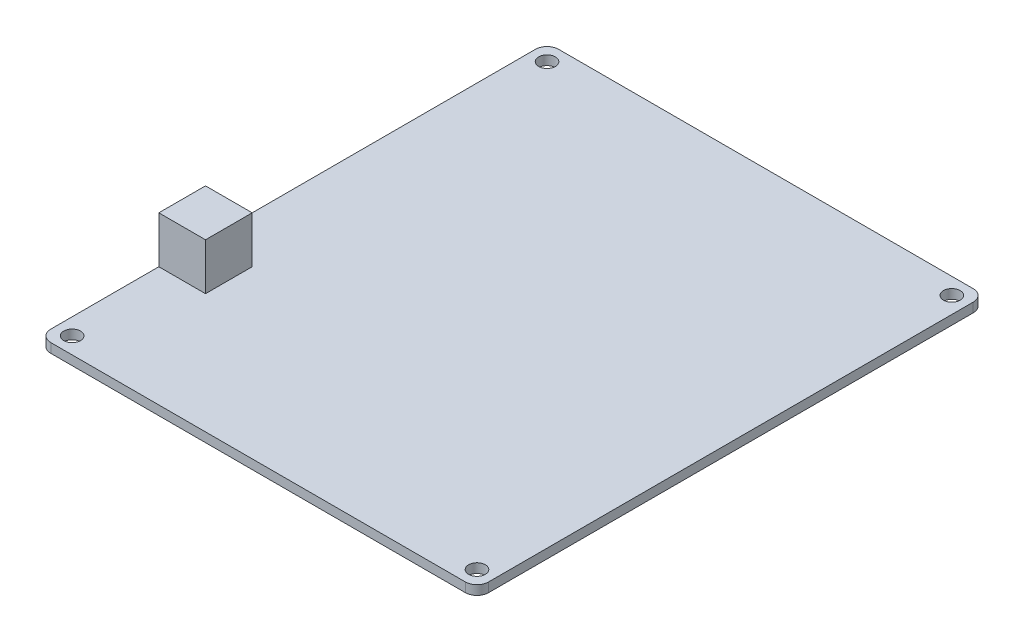
ISO-10303-21;
HEADER;
FILE_DESCRIPTION(('STEP AP214'),'2;1');
FILE_NAME('part.step','',(''),(''),'','','');
FILE_SCHEMA(('AUTOMOTIVE_DESIGN { 1 0 10303 214 1 1 1 1 }'));
ENDSEC;
DATA;
#1=APPLICATION_CONTEXT('core data for automotive mechanical design processes');
#2=APPLICATION_PROTOCOL_DEFINITION('international standard','automotive_design',2000,#1);
#3=PRODUCT_CONTEXT('',#1,'mechanical');
#4=PRODUCT('Part','Part','',(#3));
#5=PRODUCT_RELATED_PRODUCT_CATEGORY('part','',(#4));
#6=PRODUCT_DEFINITION_FORMATION('','',#4);
#7=PRODUCT_DEFINITION_CONTEXT('part definition',#1,'design');
#8=PRODUCT_DEFINITION('design','',#6,#7);
#9=PRODUCT_DEFINITION_SHAPE('','',#8);
#10=(LENGTH_UNIT() NAMED_UNIT(*) SI_UNIT(.MILLI.,.METRE.));
#11=(NAMED_UNIT(*) PLANE_ANGLE_UNIT() SI_UNIT($,.RADIAN.));
#12=(NAMED_UNIT(*) SI_UNIT($,.STERADIAN.) SOLID_ANGLE_UNIT());
#13=UNCERTAINTY_MEASURE_WITH_UNIT(LENGTH_MEASURE(1.E-05),#10,'distance_accuracy_value','');
#14=(GEOMETRIC_REPRESENTATION_CONTEXT(3) GLOBAL_UNCERTAINTY_ASSIGNED_CONTEXT((#13)) GLOBAL_UNIT_ASSIGNED_CONTEXT((#10,
#11,#12)) REPRESENTATION_CONTEXT('',''));
#15=CARTESIAN_POINT('',(0.,0.,0.));
#16=DIRECTION('',(0.,0.,1.));
#17=DIRECTION('',(1.,0.,0.));
#18=AXIS2_PLACEMENT_3D('',#15,#16,#17);
#19=CARTESIAN_POINT('',(-37.5,1.6,43.5));
#20=DIRECTION('',(0.,0.,-1.));
#21=DIRECTION('',(-1.,0.,0.));
#22=AXIS2_PLACEMENT_3D('',#19,#20,#21);
#23=PLANE('',#22);
#24=DIRECTION('',(1.,0.,0.));
#25=VECTOR('',#24,1.);
#26=CARTESIAN_POINT('',(-37.5,0.,43.5));
#27=LINE('',#26,#25);
#28=CARTESIAN_POINT('',(-35.5,0.,43.5));
#29=VERTEX_POINT('',#28);
#30=CARTESIAN_POINT('',(35.5,0.,43.5));
#31=VERTEX_POINT('',#30);
#32=EDGE_CURVE('E197',#29,#31,#27,.T.);
#33=ORIENTED_EDGE('',*,*,#32,.T.);
#34=DIRECTION('',(0.,-1.,0.));
#35=VECTOR('',#34,1.);
#36=CARTESIAN_POINT('',(35.5,1.6,43.5));
#37=LINE('',#36,#35);
#38=CARTESIAN_POINT('',(35.5,1.6,43.5));
#39=VERTEX_POINT('',#38);
#40=EDGE_CURVE('E253',#31,#39,#37,.F.);
#41=ORIENTED_EDGE('',*,*,#40,.T.);
#42=DIRECTION('',(1.,0.,0.));
#43=VECTOR('',#42,1.);
#44=CARTESIAN_POINT('',(-37.5,1.6,43.5));
#45=LINE('',#44,#43);
#46=CARTESIAN_POINT('',(-35.5,1.6,43.5));
#47=VERTEX_POINT('',#46);
#48=EDGE_CURVE('E201',#47,#39,#45,.T.);
#49=ORIENTED_EDGE('',*,*,#48,.F.);
#50=DIRECTION('',(0.,-1.,0.));
#51=VECTOR('',#50,1.);
#52=CARTESIAN_POINT('',(-35.5,0.,43.5));
#53=LINE('',#52,#51);
#54=EDGE_CURVE('E249',#47,#29,#53,.T.);
#55=ORIENTED_EDGE('',*,*,#54,.T.);
#56=EDGE_LOOP('',(#33,#41,#49,#55));
#57=FACE_BOUND('',#56,.T.);
#58=ADVANCED_FACE('F45',(#57),#23,.F.);
#59=CARTESIAN_POINT('',(37.5,1.6,43.5));
#60=DIRECTION('',(-1.,0.,0.));
#61=DIRECTION('',(0.,0.,1.));
#62=AXIS2_PLACEMENT_3D('',#59,#60,#61);
#63=PLANE('',#62);
#64=DIRECTION('',(0.,0.,-1.));
#65=VECTOR('',#64,1.);
#66=CARTESIAN_POINT('',(37.5,1.6,43.5));
#67=LINE('',#66,#65);
#68=CARTESIAN_POINT('',(37.5,1.6,41.5));
#69=VERTEX_POINT('',#68);
#70=CARTESIAN_POINT('',(37.5,1.6,-41.5));
#71=VERTEX_POINT('',#70);
#72=EDGE_CURVE('E205',#69,#71,#67,.T.);
#73=ORIENTED_EDGE('',*,*,#72,.F.);
#74=DIRECTION('',(0.,-1.,0.));
#75=VECTOR('',#74,1.);
#76=CARTESIAN_POINT('',(37.5,1.6,41.5));
#77=LINE('',#76,#75);
#78=CARTESIAN_POINT('',(37.5,0.,41.5));
#79=VERTEX_POINT('',#78);
#80=EDGE_CURVE('E233',#69,#79,#77,.T.);
#81=ORIENTED_EDGE('',*,*,#80,.T.);
#82=DIRECTION('',(0.,0.,-1.));
#83=VECTOR('',#82,1.);
#84=CARTESIAN_POINT('',(37.5,0.,43.5));
#85=LINE('',#84,#83);
#86=CARTESIAN_POINT('',(37.5,0.,-41.5));
#87=VERTEX_POINT('',#86);
#88=EDGE_CURVE('E220',#79,#87,#85,.T.);
#89=ORIENTED_EDGE('',*,*,#88,.T.);
#90=DIRECTION('',(0.,-1.,0.));
#91=VECTOR('',#90,1.);
#92=CARTESIAN_POINT('',(37.5,1.6,-41.5));
#93=LINE('',#92,#91);
#94=EDGE_CURVE('E216',#87,#71,#93,.F.);
#95=ORIENTED_EDGE('',*,*,#94,.T.);
#96=EDGE_LOOP('',(#73,#81,#89,#95));
#97=FACE_BOUND('',#96,.T.);
#98=ADVANCED_FACE('F305',(#97),#63,.F.);
#99=CARTESIAN_POINT('',(-37.5,1.6,-43.5));
#100=DIRECTION('',(0.,0.,-1.));
#101=DIRECTION('',(-1.,0.,0.));
#102=AXIS2_PLACEMENT_3D('',#99,#100,#101);
#103=PLANE('',#102);
#104=DIRECTION('',(1.,0.,0.));
#105=VECTOR('',#104,1.);
#106=CARTESIAN_POINT('',(-37.5,1.6,-43.5));
#107=LINE('',#106,#105);
#108=CARTESIAN_POINT('',(-35.5,1.6,-43.5));
#109=VERTEX_POINT('',#108);
#110=CARTESIAN_POINT('',(35.5,1.6,-43.5));
#111=VERTEX_POINT('',#110);
#112=EDGE_CURVE('E210',#109,#111,#107,.T.);
#113=ORIENTED_EDGE('',*,*,#112,.T.);
#114=DIRECTION('',(0.,-1.,0.));
#115=VECTOR('',#114,1.);
#116=CARTESIAN_POINT('',(35.5,0.,-43.5));
#117=LINE('',#116,#115);
#118=CARTESIAN_POINT('',(35.5,0.,-43.5));
#119=VERTEX_POINT('',#118);
#120=EDGE_CURVE('E11',#111,#119,#117,.T.);
#121=ORIENTED_EDGE('',*,*,#120,.T.);
#122=DIRECTION('',(1.,0.,0.));
#123=VECTOR('',#122,1.);
#124=CARTESIAN_POINT('',(-37.5,0.,-43.5));
#125=LINE('',#124,#123);
#126=CARTESIAN_POINT('',(-35.5,0.,-43.5));
#127=VERTEX_POINT('',#126);
#128=EDGE_CURVE('E224',#127,#119,#125,.T.);
#129=ORIENTED_EDGE('',*,*,#128,.F.);
#130=DIRECTION('',(0.,-1.,0.));
#131=VECTOR('',#130,1.);
#132=CARTESIAN_POINT('',(-35.5,1.6,-43.5));
#133=LINE('',#132,#131);
#134=EDGE_CURVE('E54',#127,#109,#133,.F.);
#135=ORIENTED_EDGE('',*,*,#134,.T.);
#136=EDGE_LOOP('',(#113,#121,#129,#135));
#137=FACE_BOUND('',#136,.T.);
#138=ADVANCED_FACE('F279',(#137),#103,.T.);
#139=CARTESIAN_POINT('',(-37.5,1.6,43.5));
#140=DIRECTION('',(-1.,0.,0.));
#141=DIRECTION('',(0.,0.,1.));
#142=AXIS2_PLACEMENT_3D('',#139,#140,#141);
#143=PLANE('',#142);
#144=DIRECTION('',(0.,0.,-1.));
#145=VECTOR('',#144,1.);
#146=CARTESIAN_POINT('',(-37.5,0.,43.5));
#147=LINE('',#146,#145);
#148=CARTESIAN_POINT('',(-37.5,0.,41.5));
#149=VERTEX_POINT('',#148);
#150=CARTESIAN_POINT('',(-37.5,0.,-41.5));
#151=VERTEX_POINT('',#150);
#152=EDGE_CURVE('E206',#149,#151,#147,.T.);
#153=ORIENTED_EDGE('',*,*,#152,.F.);
#154=DIRECTION('',(0.,-1.,0.));
#155=VECTOR('',#154,1.);
#156=CARTESIAN_POINT('',(-37.5,1.6,41.5));
#157=LINE('',#156,#155);
#158=CARTESIAN_POINT('',(-37.5,1.6,41.5));
#159=VERTEX_POINT('',#158);
#160=EDGE_CURVE('E272',#149,#159,#157,.F.);
#161=ORIENTED_EDGE('',*,*,#160,.T.);
#162=DIRECTION('',(0.,0.,-1.));
#163=VECTOR('',#162,1.);
#164=CARTESIAN_POINT('',(-37.5,1.6,43.5));
#165=LINE('',#164,#163);
#166=CARTESIAN_POINT('',(-37.5,1.6,23.));
#167=VERTEX_POINT('',#166);
#168=EDGE_CURVE('E160',#159,#167,#165,.T.);
#169=ORIENTED_EDGE('',*,*,#168,.T.);
#170=DIRECTION('',(0.,-1.,0.));
#171=VECTOR('',#170,1.);
#172=CARTESIAN_POINT('',(-37.5,9.6,23.));
#173=LINE('',#172,#171);
#174=CARTESIAN_POINT('',(-37.5,9.6,23.));
#175=VERTEX_POINT('',#174);
#176=EDGE_CURVE('E138',#175,#167,#173,.T.);
#177=ORIENTED_EDGE('',*,*,#176,.F.);
#178=DIRECTION('',(0.,0.,1.));
#179=VECTOR('',#178,1.);
#180=CARTESIAN_POINT('',(-37.5,9.6,23.));
#181=LINE('',#180,#179);
#182=CARTESIAN_POINT('',(-37.5,9.6,15.));
#183=VERTEX_POINT('',#182);
#184=EDGE_CURVE('E145',#183,#175,#181,.T.);
#185=ORIENTED_EDGE('',*,*,#184,.F.);
#186=DIRECTION('',(0.,-1.,0.));
#187=VECTOR('',#186,1.);
#188=CARTESIAN_POINT('',(-37.5,9.6,15.));
#189=LINE('',#188,#187);
#190=CARTESIAN_POINT('',(-37.5,1.6,15.));
#191=VERTEX_POINT('',#190);
#192=EDGE_CURVE('E458',#183,#191,#189,.T.);
#193=ORIENTED_EDGE('',*,*,#192,.T.);
#194=CARTESIAN_POINT('',(-37.5,1.6,-41.5));
#195=VERTEX_POINT('',#194);
#196=EDGE_CURVE('E66',#191,#195,#165,.T.);
#197=ORIENTED_EDGE('',*,*,#196,.T.);
#198=DIRECTION('',(0.,-1.,0.));
#199=VECTOR('',#198,1.);
#200=CARTESIAN_POINT('',(-37.5,1.6,-41.5));
#201=LINE('',#200,#199);
#202=EDGE_CURVE('E268',#195,#151,#201,.T.);
#203=ORIENTED_EDGE('',*,*,#202,.T.);
#204=EDGE_LOOP('',(#153,#161,#169,#177,#185,#193,#197,#203));
#205=FACE_BOUND('',#204,.T.);
#206=ADVANCED_FACE('F158',(#205),#143,.T.);
#207=CARTESIAN_POINT('',(0.,1.6,0.));
#208=DIRECTION('',(0.,1.,0.));
#209=DIRECTION('',(0.,0.,1.));
#210=AXIS2_PLACEMENT_3D('',#207,#208,#209);
#211=PLANE('',#210);
#212=DIRECTION('',(-1.,0.,0.));
#213=VECTOR('',#212,1.);
#214=CARTESIAN_POINT('',(-29.5,1.6,15.));
#215=LINE('',#214,#213);
#216=CARTESIAN_POINT('',(-29.5,1.6,15.));
#217=VERTEX_POINT('',#216);
#218=EDGE_CURVE('E61',#217,#191,#215,.T.);
#219=ORIENTED_EDGE('',*,*,#218,.F.);
#220=DIRECTION('',(0.,0.,-1.));
#221=VECTOR('',#220,1.);
#222=CARTESIAN_POINT('',(-29.5,1.6,23.));
#223=LINE('',#222,#221);
#224=CARTESIAN_POINT('',(-29.5,1.6,23.));
#225=VERTEX_POINT('',#224);
#226=EDGE_CURVE('E461',#225,#217,#223,.T.);
#227=ORIENTED_EDGE('',*,*,#226,.F.);
#228=DIRECTION('',(1.,0.,0.));
#229=VECTOR('',#228,1.);
#230=CARTESIAN_POINT('',(-29.5,1.6,23.));
#231=LINE('',#230,#229);
#232=EDGE_CURVE('E471',#167,#225,#231,.T.);
#233=ORIENTED_EDGE('',*,*,#232,.F.);
#234=ORIENTED_EDGE('',*,*,#168,.F.);
#235=CARTESIAN_POINT('',(-35.5,1.6,41.5));
#236=DIRECTION('',(0.,1.,0.));
#237=DIRECTION('',(0.,0.,1.));
#238=AXIS2_PLACEMENT_3D('',#235,#236,#237);
#239=CIRCLE('',#238,2.);
#240=EDGE_CURVE('E262',#159,#47,#239,.T.);
#241=ORIENTED_EDGE('',*,*,#240,.T.);
#242=ORIENTED_EDGE('',*,*,#48,.T.);
#243=CARTESIAN_POINT('',(35.5,1.6,41.5));
#244=DIRECTION('',(0.,1.,0.));
#245=DIRECTION('',(0.,0.,1.));
#246=AXIS2_PLACEMENT_3D('',#243,#244,#245);
#247=CIRCLE('',#246,2.);
#248=EDGE_CURVE('E265',#39,#69,#247,.T.);
#249=ORIENTED_EDGE('',*,*,#248,.T.);
#250=ORIENTED_EDGE('',*,*,#72,.T.);
#251=CARTESIAN_POINT('',(35.5,1.6,-41.5));
#252=DIRECTION('',(0.,1.,0.));
#253=DIRECTION('',(0.,0.,1.));
#254=AXIS2_PLACEMENT_3D('',#251,#252,#253);
#255=CIRCLE('',#254,2.);
#256=EDGE_CURVE('E259',#71,#111,#255,.T.);
#257=ORIENTED_EDGE('',*,*,#256,.T.);
#258=ORIENTED_EDGE('',*,*,#112,.F.);
#259=CARTESIAN_POINT('',(-35.5,1.6,-41.5));
#260=DIRECTION('',(0.,1.,0.));
#261=DIRECTION('',(0.,0.,1.));
#262=AXIS2_PLACEMENT_3D('',#259,#260,#261);
#263=CIRCLE('',#262,2.);
#264=EDGE_CURVE('E256',#109,#195,#263,.T.);
#265=ORIENTED_EDGE('',*,*,#264,.T.);
#266=ORIENTED_EDGE('',*,*,#196,.F.);
#267=EDGE_LOOP('',(#219,#227,#233,#234,#241,#242,#249,#250,#257,#258,#265,#266));
#268=FACE_BOUND('',#267,.T.);
#269=CARTESIAN_POINT('',(34.67,1.6,40.67));
#270=DIRECTION('',(0.,1.,0.));
#271=DIRECTION('',(0.,0.,-1.));
#272=AXIS2_PLACEMENT_3D('',#269,#270,#271);
#273=CIRCLE('',#272,1.43);
#274=CARTESIAN_POINT('',(34.67,1.6,39.24));
#275=VERTEX_POINT('',#274);
#276=EDGE_CURVE('E162',#275,#275,#273,.T.);
#277=ORIENTED_EDGE('',*,*,#276,.F.);
#278=EDGE_LOOP('',(#277));
#279=FACE_BOUND('',#278,.T.);
#280=CARTESIAN_POINT('',(-34.67,1.6,40.67));
#281=DIRECTION('',(0.,-1.,0.));
#282=DIRECTION('',(0.,0.,-1.));
#283=AXIS2_PLACEMENT_3D('',#280,#281,#282);
#284=CIRCLE('',#283,1.43);
#285=CARTESIAN_POINT('',(-34.67,1.6,39.24));
#286=VERTEX_POINT('',#285);
#287=EDGE_CURVE('E175',#286,#286,#284,.T.);
#288=ORIENTED_EDGE('',*,*,#287,.T.);
#289=EDGE_LOOP('',(#288));
#290=FACE_BOUND('',#289,.T.);
#291=CARTESIAN_POINT('',(34.67,1.6,-40.67));
#292=DIRECTION('',(0.,-1.,0.));
#293=DIRECTION('',(0.,0.,1.));
#294=AXIS2_PLACEMENT_3D('',#291,#292,#293);
#295=CIRCLE('',#294,1.43);
#296=CARTESIAN_POINT('',(34.67,1.6,-39.24));
#297=VERTEX_POINT('',#296);
#298=EDGE_CURVE('E181',#297,#297,#295,.T.);
#299=ORIENTED_EDGE('',*,*,#298,.T.);
#300=EDGE_LOOP('',(#299));
#301=FACE_BOUND('',#300,.T.);
#302=CARTESIAN_POINT('',(-34.67,1.6,-40.67));
#303=DIRECTION('',(0.,1.,0.));
#304=DIRECTION('',(0.,0.,1.));
#305=AXIS2_PLACEMENT_3D('',#302,#303,#304);
#306=CIRCLE('',#305,1.43);
#307=CARTESIAN_POINT('',(-34.67,1.6,-39.24));
#308=VERTEX_POINT('',#307);
#309=EDGE_CURVE('E189',#308,#308,#306,.T.);
#310=ORIENTED_EDGE('',*,*,#309,.F.);
#311=EDGE_LOOP('',(#310));
#312=FACE_BOUND('',#311,.T.);
#313=ADVANCED_FACE('F283',(#268,#279,#290,#301,#312),#211,.T.);
#314=CARTESIAN_POINT('',(0.,0.,0.));
#315=DIRECTION('',(0.,1.,0.));
#316=DIRECTION('',(0.,0.,1.));
#317=AXIS2_PLACEMENT_3D('',#314,#315,#316);
#318=PLANE('',#317);
#319=CARTESIAN_POINT('',(34.67,0.,40.67));
#320=DIRECTION('',(0.,1.,0.));
#321=DIRECTION('',(0.,0.,-1.));
#322=AXIS2_PLACEMENT_3D('',#319,#320,#321);
#323=CIRCLE('',#322,1.43);
#324=CARTESIAN_POINT('',(34.67,0.,39.24));
#325=VERTEX_POINT('',#324);
#326=EDGE_CURVE('E167',#325,#325,#323,.T.);
#327=ORIENTED_EDGE('',*,*,#326,.T.);
#328=EDGE_LOOP('',(#327));
#329=FACE_BOUND('',#328,.T.);
#330=CARTESIAN_POINT('',(-34.67,0.,40.67));
#331=DIRECTION('',(0.,-1.,0.));
#332=DIRECTION('',(0.,0.,-1.));
#333=AXIS2_PLACEMENT_3D('',#330,#331,#332);
#334=CIRCLE('',#333,1.43);
#335=CARTESIAN_POINT('',(-34.67,0.,39.24));
#336=VERTEX_POINT('',#335);
#337=EDGE_CURVE('E177',#336,#336,#334,.T.);
#338=ORIENTED_EDGE('',*,*,#337,.F.);
#339=EDGE_LOOP('',(#338));
#340=FACE_BOUND('',#339,.T.);
#341=CARTESIAN_POINT('',(34.67,0.,-40.67));
#342=DIRECTION('',(0.,-1.,0.));
#343=DIRECTION('',(0.,0.,1.));
#344=AXIS2_PLACEMENT_3D('',#341,#342,#343);
#345=CIRCLE('',#344,1.43);
#346=CARTESIAN_POINT('',(34.67,0.,-39.24));
#347=VERTEX_POINT('',#346);
#348=EDGE_CURVE('E185',#347,#347,#345,.T.);
#349=ORIENTED_EDGE('',*,*,#348,.F.);
#350=EDGE_LOOP('',(#349));
#351=FACE_BOUND('',#350,.T.);
#352=CARTESIAN_POINT('',(-34.67,0.,-40.67));
#353=DIRECTION('',(0.,1.,0.));
#354=DIRECTION('',(0.,0.,1.));
#355=AXIS2_PLACEMENT_3D('',#352,#353,#354);
#356=CIRCLE('',#355,1.43);
#357=CARTESIAN_POINT('',(-34.67,0.,-39.24));
#358=VERTEX_POINT('',#357);
#359=EDGE_CURVE('E193',#358,#358,#356,.T.);
#360=ORIENTED_EDGE('',*,*,#359,.T.);
#361=EDGE_LOOP('',(#360));
#362=FACE_BOUND('',#361,.T.);
#363=ORIENTED_EDGE('',*,*,#88,.F.);
#364=CARTESIAN_POINT('',(35.5,0.,41.5));
#365=DIRECTION('',(0.,1.,0.));
#366=DIRECTION('',(0.,0.,1.));
#367=AXIS2_PLACEMENT_3D('',#364,#365,#366);
#368=CIRCLE('',#367,2.);
#369=EDGE_CURVE('E246',#79,#31,#368,.F.);
#370=ORIENTED_EDGE('',*,*,#369,.T.);
#371=ORIENTED_EDGE('',*,*,#32,.F.);
#372=CARTESIAN_POINT('',(-35.5,0.,41.5));
#373=DIRECTION('',(0.,1.,0.));
#374=DIRECTION('',(0.,0.,1.));
#375=AXIS2_PLACEMENT_3D('',#372,#373,#374);
#376=CIRCLE('',#375,2.);
#377=EDGE_CURVE('E243',#29,#149,#376,.F.);
#378=ORIENTED_EDGE('',*,*,#377,.T.);
#379=ORIENTED_EDGE('',*,*,#152,.T.);
#380=CARTESIAN_POINT('',(-35.5,0.,-41.5));
#381=DIRECTION('',(0.,1.,0.));
#382=DIRECTION('',(0.,0.,1.));
#383=AXIS2_PLACEMENT_3D('',#380,#381,#382);
#384=CIRCLE('',#383,2.);
#385=EDGE_CURVE('E237',#151,#127,#384,.F.);
#386=ORIENTED_EDGE('',*,*,#385,.T.);
#387=ORIENTED_EDGE('',*,*,#128,.T.);
#388=CARTESIAN_POINT('',(35.5,0.,-41.5));
#389=DIRECTION('',(0.,1.,0.));
#390=DIRECTION('',(0.,0.,1.));
#391=AXIS2_PLACEMENT_3D('',#388,#389,#390);
#392=CIRCLE('',#391,2.);
#393=EDGE_CURVE('E240',#119,#87,#392,.F.);
#394=ORIENTED_EDGE('',*,*,#393,.T.);
#395=EDGE_LOOP('',(#363,#370,#371,#378,#379,#386,#387,#394));
#396=FACE_BOUND('',#395,.T.);
#397=ADVANCED_FACE('F290',(#329,#340,#351,#362,#396),#318,.F.);
#398=CARTESIAN_POINT('',(-34.67,0.,-40.67));
#399=DIRECTION('',(0.,1.,0.));
#400=DIRECTION('',(0.,0.,1.));
#401=AXIS2_PLACEMENT_3D('',#398,#399,#400);
#402=CYLINDRICAL_SURFACE('',#401,1.43);
#403=ORIENTED_EDGE('',*,*,#359,.F.);
#404=EDGE_LOOP('',(#403));
#405=FACE_BOUND('',#404,.T.);
#406=ORIENTED_EDGE('',*,*,#309,.T.);
#407=EDGE_LOOP('',(#406));
#408=FACE_BOUND('',#407,.T.);
#409=ADVANCED_FACE('F345',(#405,#408),#402,.F.);
#410=CARTESIAN_POINT('',(34.67,0.,-40.67));
#411=DIRECTION('',(0.,1.,0.));
#412=DIRECTION('',(0.,0.,1.));
#413=AXIS2_PLACEMENT_3D('',#410,#411,#412);
#414=CYLINDRICAL_SURFACE('',#413,1.43);
#415=ORIENTED_EDGE('',*,*,#348,.T.);
#416=EDGE_LOOP('',(#415));
#417=FACE_BOUND('',#416,.T.);
#418=ORIENTED_EDGE('',*,*,#298,.F.);
#419=EDGE_LOOP('',(#418));
#420=FACE_BOUND('',#419,.T.);
#421=ADVANCED_FACE('F335',(#417,#420),#414,.F.);
#422=CARTESIAN_POINT('',(-34.67,0.,40.67));
#423=DIRECTION('',(0.,1.,0.));
#424=DIRECTION('',(0.,0.,1.));
#425=AXIS2_PLACEMENT_3D('',#422,#423,#424);
#426=CYLINDRICAL_SURFACE('',#425,1.43);
#427=ORIENTED_EDGE('',*,*,#337,.T.);
#428=EDGE_LOOP('',(#427));
#429=FACE_BOUND('',#428,.T.);
#430=ORIENTED_EDGE('',*,*,#287,.F.);
#431=EDGE_LOOP('',(#430));
#432=FACE_BOUND('',#431,.T.);
#433=ADVANCED_FACE('F329',(#429,#432),#426,.F.);
#434=CARTESIAN_POINT('',(34.67,0.,40.67));
#435=DIRECTION('',(0.,1.,0.));
#436=DIRECTION('',(0.,0.,1.));
#437=AXIS2_PLACEMENT_3D('',#434,#435,#436);
#438=CYLINDRICAL_SURFACE('',#437,1.43);
#439=ORIENTED_EDGE('',*,*,#326,.F.);
#440=EDGE_LOOP('',(#439));
#441=FACE_BOUND('',#440,.T.);
#442=ORIENTED_EDGE('',*,*,#276,.T.);
#443=EDGE_LOOP('',(#442));
#444=FACE_BOUND('',#443,.T.);
#445=ADVANCED_FACE('F325',(#441,#444),#438,.F.);
#446=CARTESIAN_POINT('',(35.5,1.6,41.5));
#447=DIRECTION('',(0.,-1.,0.));
#448=DIRECTION('',(0.,0.,-1.));
#449=AXIS2_PLACEMENT_3D('',#446,#447,#448);
#450=CYLINDRICAL_SURFACE('',#449,2.);
#451=ORIENTED_EDGE('',*,*,#248,.F.);
#452=ORIENTED_EDGE('',*,*,#40,.F.);
#453=ORIENTED_EDGE('',*,*,#369,.F.);
#454=ORIENTED_EDGE('',*,*,#80,.F.);
#455=EDGE_LOOP('',(#451,#452,#453,#454));
#456=FACE_BOUND('',#455,.T.);
#457=ADVANCED_FACE('F303',(#456),#450,.T.);
#458=CARTESIAN_POINT('',(-35.5,1.6,41.5));
#459=DIRECTION('',(0.,1.,0.));
#460=DIRECTION('',(0.,0.,1.));
#461=AXIS2_PLACEMENT_3D('',#458,#459,#460);
#462=CYLINDRICAL_SURFACE('',#461,2.);
#463=ORIENTED_EDGE('',*,*,#240,.F.);
#464=ORIENTED_EDGE('',*,*,#160,.F.);
#465=ORIENTED_EDGE('',*,*,#377,.F.);
#466=ORIENTED_EDGE('',*,*,#54,.F.);
#467=EDGE_LOOP('',(#463,#464,#465,#466));
#468=FACE_BOUND('',#467,.T.);
#469=ADVANCED_FACE('F295',(#468),#462,.T.);
#470=CARTESIAN_POINT('',(35.5,1.6,-41.5));
#471=DIRECTION('',(0.,1.,0.));
#472=DIRECTION('',(0.,0.,1.));
#473=AXIS2_PLACEMENT_3D('',#470,#471,#472);
#474=CYLINDRICAL_SURFACE('',#473,2.);
#475=ORIENTED_EDGE('',*,*,#256,.F.);
#476=ORIENTED_EDGE('',*,*,#94,.F.);
#477=ORIENTED_EDGE('',*,*,#393,.F.);
#478=ORIENTED_EDGE('',*,*,#120,.F.);
#479=EDGE_LOOP('',(#475,#476,#477,#478));
#480=FACE_BOUND('',#479,.T.);
#481=ADVANCED_FACE('F308',(#480),#474,.T.);
#482=CARTESIAN_POINT('',(-35.5,1.6,-41.5));
#483=DIRECTION('',(0.,-1.,0.));
#484=DIRECTION('',(0.,0.,-1.));
#485=AXIS2_PLACEMENT_3D('',#482,#483,#484);
#486=CYLINDRICAL_SURFACE('',#485,2.);
#487=ORIENTED_EDGE('',*,*,#264,.F.);
#488=ORIENTED_EDGE('',*,*,#134,.F.);
#489=ORIENTED_EDGE('',*,*,#385,.F.);
#490=ORIENTED_EDGE('',*,*,#202,.F.);
#491=EDGE_LOOP('',(#487,#488,#489,#490));
#492=FACE_BOUND('',#491,.T.);
#493=ADVANCED_FACE('F47',(#492),#486,.T.);
#494=CARTESIAN_POINT('',(-29.5,9.6,23.));
#495=DIRECTION('',(0.,0.,-1.));
#496=DIRECTION('',(-1.,0.,0.));
#497=AXIS2_PLACEMENT_3D('',#494,#495,#496);
#498=PLANE('',#497);
#499=ORIENTED_EDGE('',*,*,#232,.T.);
#500=DIRECTION('',(0.,-1.,0.));
#501=VECTOR('',#500,1.);
#502=CARTESIAN_POINT('',(-29.5,9.6,23.));
#503=LINE('',#502,#501);
#504=CARTESIAN_POINT('',(-29.5,9.6,23.));
#505=VERTEX_POINT('',#504);
#506=EDGE_CURVE('E140',#505,#225,#503,.T.);
#507=ORIENTED_EDGE('',*,*,#506,.F.);
#508=DIRECTION('',(1.,0.,0.));
#509=VECTOR('',#508,1.);
#510=CARTESIAN_POINT('',(-29.5,9.6,23.));
#511=LINE('',#510,#509);
#512=EDGE_CURVE('E133',#175,#505,#511,.T.);
#513=ORIENTED_EDGE('',*,*,#512,.F.);
#514=ORIENTED_EDGE('',*,*,#176,.T.);
#515=EDGE_LOOP('',(#499,#507,#513,#514));
#516=FACE_BOUND('',#515,.T.);
#517=ADVANCED_FACE('F136',(#516),#498,.F.);
#518=CARTESIAN_POINT('',(-29.5,9.6,23.));
#519=DIRECTION('',(-1.,0.,0.));
#520=DIRECTION('',(0.,0.,1.));
#521=AXIS2_PLACEMENT_3D('',#518,#519,#520);
#522=PLANE('',#521);
#523=ORIENTED_EDGE('',*,*,#226,.T.);
#524=DIRECTION('',(0.,-1.,0.));
#525=VECTOR('',#524,1.);
#526=CARTESIAN_POINT('',(-29.5,9.6,15.));
#527=LINE('',#526,#525);
#528=CARTESIAN_POINT('',(-29.5,9.6,15.));
#529=VERTEX_POINT('',#528);
#530=EDGE_CURVE('E169',#529,#217,#527,.T.);
#531=ORIENTED_EDGE('',*,*,#530,.F.);
#532=DIRECTION('',(0.,0.,-1.));
#533=VECTOR('',#532,1.);
#534=CARTESIAN_POINT('',(-29.5,9.6,23.));
#535=LINE('',#534,#533);
#536=EDGE_CURVE('E144',#505,#529,#535,.T.);
#537=ORIENTED_EDGE('',*,*,#536,.F.);
#538=ORIENTED_EDGE('',*,*,#506,.T.);
#539=EDGE_LOOP('',(#523,#531,#537,#538));
#540=FACE_BOUND('',#539,.T.);
#541=ADVANCED_FACE('F429',(#540),#522,.F.);
#542=CARTESIAN_POINT('',(-29.5,9.6,15.));
#543=DIRECTION('',(0.,0.,1.));
#544=DIRECTION('',(1.,0.,0.));
#545=AXIS2_PLACEMENT_3D('',#542,#543,#544);
#546=PLANE('',#545);
#547=ORIENTED_EDGE('',*,*,#218,.T.);
#548=ORIENTED_EDGE('',*,*,#192,.F.);
#549=DIRECTION('',(-1.,0.,0.));
#550=VECTOR('',#549,1.);
#551=CARTESIAN_POINT('',(-29.5,9.6,15.));
#552=LINE('',#551,#550);
#553=EDGE_CURVE('E150',#529,#183,#552,.T.);
#554=ORIENTED_EDGE('',*,*,#553,.F.);
#555=ORIENTED_EDGE('',*,*,#530,.T.);
#556=EDGE_LOOP('',(#547,#548,#554,#555));
#557=FACE_BOUND('',#556,.T.);
#558=ADVANCED_FACE('F437',(#557),#546,.F.);
#559=CARTESIAN_POINT('',(0.,9.6,0.));
#560=DIRECTION('',(0.,1.,0.));
#561=DIRECTION('',(0.,0.,1.));
#562=AXIS2_PLACEMENT_3D('',#559,#560,#561);
#563=PLANE('',#562);
#564=ORIENTED_EDGE('',*,*,#184,.T.);
#565=ORIENTED_EDGE('',*,*,#512,.T.);
#566=ORIENTED_EDGE('',*,*,#536,.T.);
#567=ORIENTED_EDGE('',*,*,#553,.T.);
#568=EDGE_LOOP('',(#564,#565,#566,#567));
#569=FACE_BOUND('',#568,.T.);
#570=ADVANCED_FACE('F148',(#569),#563,.T.);
#571=CLOSED_SHELL('',(#58,#98,#138,#206,#313,#397,#409,#421,#433,#445,#457,#469,#481,#493,#517,
#541,#558,#570));
#572=MANIFOLD_SOLID_BREP('B2',#571);
#573=ADVANCED_BREP_SHAPE_REPRESENTATION('',(#18,#572),#14);
#574=SHAPE_DEFINITION_REPRESENTATION(#9,#573);
ENDSEC;
END-ISO-10303-21;
